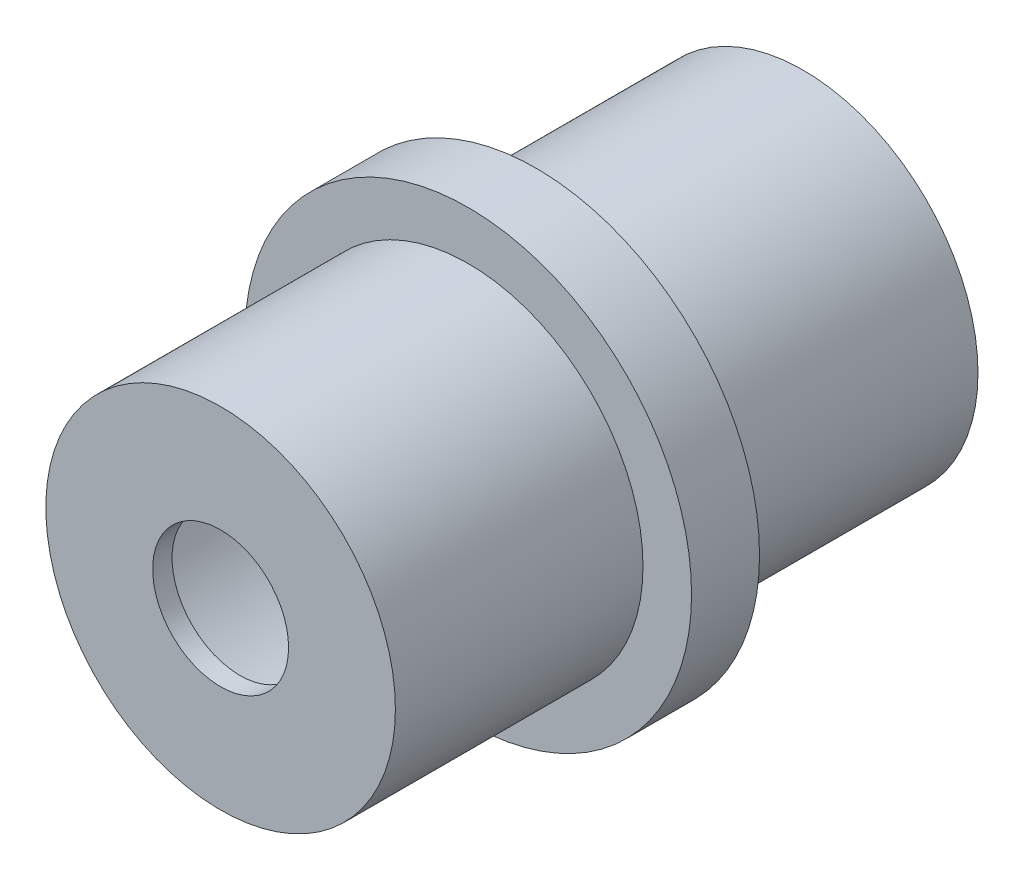
ISO-10303-21;
HEADER;
FILE_DESCRIPTION(('STEP AP214'),'2;1');
FILE_NAME('part.step','',(''),(''),'','','');
FILE_SCHEMA(('AUTOMOTIVE_DESIGN { 1 0 10303 214 1 1 1 1 }'));
ENDSEC;
DATA;
#1=APPLICATION_CONTEXT('core data for automotive mechanical design processes');
#2=APPLICATION_PROTOCOL_DEFINITION('international standard','automotive_design',2000,#1);
#3=PRODUCT_CONTEXT('',#1,'mechanical');
#4=PRODUCT('Part','Part','',(#3));
#5=PRODUCT_RELATED_PRODUCT_CATEGORY('part','',(#4));
#6=PRODUCT_DEFINITION_FORMATION('','',#4);
#7=PRODUCT_DEFINITION_CONTEXT('part definition',#1,'design');
#8=PRODUCT_DEFINITION('design','',#6,#7);
#9=PRODUCT_DEFINITION_SHAPE('','',#8);
#10=(LENGTH_UNIT() NAMED_UNIT(*) SI_UNIT(.MILLI.,.METRE.));
#11=(NAMED_UNIT(*) PLANE_ANGLE_UNIT() SI_UNIT($,.RADIAN.));
#12=(NAMED_UNIT(*) SI_UNIT($,.STERADIAN.) SOLID_ANGLE_UNIT());
#13=UNCERTAINTY_MEASURE_WITH_UNIT(LENGTH_MEASURE(1.E-05),#10,'distance_accuracy_value','');
#14=(GEOMETRIC_REPRESENTATION_CONTEXT(3) GLOBAL_UNCERTAINTY_ASSIGNED_CONTEXT((#13)) GLOBAL_UNIT_ASSIGNED_CONTEXT((#10,
#11,#12)) REPRESENTATION_CONTEXT('',''));
#15=CARTESIAN_POINT('',(0.,0.,0.));
#16=DIRECTION('',(0.,0.,1.));
#17=DIRECTION('',(1.,0.,0.));
#18=AXIS2_PLACEMENT_3D('',#15,#16,#17);
#19=CARTESIAN_POINT('',(0.,0.,1072.38147752167));
#20=DIRECTION('',(0.,0.,1.));
#21=DIRECTION('',(1.,0.,0.));
#22=AXIS2_PLACEMENT_3D('',#19,#20,#21);
#23=CYLINDRICAL_SURFACE('',#22,17.);
#24=CARTESIAN_POINT('',(0.,0.,2.));
#25=DIRECTION('',(0.,0.,1.));
#26=DIRECTION('',(1.,0.,0.));
#27=AXIS2_PLACEMENT_3D('',#24,#25,#26);
#28=CIRCLE('',#27,17.);
#29=CARTESIAN_POINT('',(17.,0.,2.));
#30=VERTEX_POINT('',#29);
#31=EDGE_CURVE('E289',#30,#30,#28,.T.);
#32=ORIENTED_EDGE('',*,*,#31,.F.);
#33=EDGE_LOOP('',(#32));
#34=FACE_BOUND('',#33,.T.);
#35=CARTESIAN_POINT('',(0.,0.,30.));
#36=DIRECTION('',(0.,0.,1.));
#37=DIRECTION('',(1.,0.,0.));
#38=AXIS2_PLACEMENT_3D('',#35,#36,#37);
#39=CIRCLE('',#38,17.);
#40=CARTESIAN_POINT('',(-4.68395766336508,16.3419870458829,30.));
#41=VERTEX_POINT('',#40);
#42=CARTESIAN_POINT('',(4.68395766336508,16.3419870458829,30.));
#43=VERTEX_POINT('',#42);
#44=EDGE_CURVE('E413',#41,#43,#39,.F.);
#45=ORIENTED_EDGE('',*,*,#44,.F.);
#46=DIRECTION('',(0.,0.,1.));
#47=VECTOR('',#46,1.);
#48=CARTESIAN_POINT('',(-4.68395766336508,16.3419870458829,29.));
#49=LINE('',#48,#47);
#50=CARTESIAN_POINT('',(-4.68395766336508,16.3419870458829,29.));
#51=VERTEX_POINT('',#50);
#52=EDGE_CURVE('E256',#51,#41,#49,.T.);
#53=ORIENTED_EDGE('',*,*,#52,.F.);
#54=CARTESIAN_POINT('',(0.,0.,29.));
#55=DIRECTION('',(0.,0.,1.));
#56=DIRECTION('',(1.,0.,0.));
#57=AXIS2_PLACEMENT_3D('',#54,#55,#56);
#58=CIRCLE('',#57,17.);
#59=CARTESIAN_POINT('',(4.68395766336508,16.3419870458829,29.));
#60=VERTEX_POINT('',#59);
#61=EDGE_CURVE('E781',#51,#60,#58,.T.);
#62=ORIENTED_EDGE('',*,*,#61,.T.);
#63=DIRECTION('',(0.,0.,1.));
#64=VECTOR('',#63,1.);
#65=CARTESIAN_POINT('',(4.68395766336508,16.3419870458829,29.));
#66=LINE('',#65,#64);
#67=EDGE_CURVE('E260',#60,#43,#66,.T.);
#68=ORIENTED_EDGE('',*,*,#67,.T.);
#69=EDGE_LOOP('',(#45,#53,#62,#68));
#70=FACE_BOUND('',#69,.T.);
#71=ADVANCED_FACE('F82',(#34,#70),#23,.F.);
#72=CARTESIAN_POINT('',(0.,0.,29.));
#73=DIRECTION('',(0.939692620785896,-0.342020143325703,0.));
#74=DIRECTION('',(0.342020143325703,0.939692620785896,0.));
#75=AXIS2_PLACEMENT_3D('',#72,#73,#74);
#76=PLANE('',#75);
#77=DIRECTION('',(0.342020143325703,0.939692620785896,0.));
#78=VECTOR('',#77,1.);
#79=CARTESIAN_POINT('',(0.,0.,30.));
#80=LINE('',#79,#78);
#81=CARTESIAN_POINT('',(6.49838272318844,17.8541597949322,30.));
#82=VERTEX_POINT('',#81);
#83=CARTESIAN_POINT('',(7.52444315316555,20.6732376572899,30.));
#84=VERTEX_POINT('',#83);
#85=EDGE_CURVE('E229',#82,#84,#80,.T.);
#86=ORIENTED_EDGE('',*,*,#85,.T.);
#87=DIRECTION('',(0.,0.,1.));
#88=VECTOR('',#87,1.);
#89=CARTESIAN_POINT('',(7.52444315316555,20.6732376572899,29.));
#90=LINE('',#89,#88);
#91=CARTESIAN_POINT('',(7.52444315316555,20.6732376572899,29.));
#92=VERTEX_POINT('',#91);
#93=EDGE_CURVE('E226',#92,#84,#90,.T.);
#94=ORIENTED_EDGE('',*,*,#93,.F.);
#95=DIRECTION('',(0.342020143325703,0.939692620785896,0.));
#96=VECTOR('',#95,1.);
#97=CARTESIAN_POINT('',(0.,0.,29.));
#98=LINE('',#97,#96);
#99=CARTESIAN_POINT('',(6.49838272318844,17.8541597949322,29.));
#100=VERTEX_POINT('',#99);
#101=EDGE_CURVE('E786',#100,#92,#98,.T.);
#102=ORIENTED_EDGE('',*,*,#101,.F.);
#103=DIRECTION('',(0.,0.,1.));
#104=VECTOR('',#103,1.);
#105=CARTESIAN_POINT('',(6.49838272318844,17.8541597949322,29.));
#106=LINE('',#105,#104);
#107=EDGE_CURVE('E280',#100,#82,#106,.T.);
#108=ORIENTED_EDGE('',*,*,#107,.T.);
#109=EDGE_LOOP('',(#86,#94,#102,#108));
#110=FACE_BOUND('',#109,.T.);
#111=ADVANCED_FACE('F324',(#110),#76,.F.);
#112=CARTESIAN_POINT('',(0.,0.,29.));
#113=DIRECTION('',(0.,0.,1.));
#114=DIRECTION('',(1.,0.,0.));
#115=AXIS2_PLACEMENT_3D('',#112,#113,#114);
#116=CYLINDRICAL_SURFACE('',#115,19.);
#117=DIRECTION('',(0.,0.,1.));
#118=VECTOR('',#117,1.);
#119=CARTESIAN_POINT('',(-6.49838272317903,17.8541597949354,29.));
#120=LINE('',#119,#118);
#121=CARTESIAN_POINT('',(-6.49838272317903,17.8541597949354,29.));
#122=VERTEX_POINT('',#121);
#123=CARTESIAN_POINT('',(-6.49838272317903,17.8541597949354,30.));
#124=VERTEX_POINT('',#123);
#125=EDGE_CURVE('E246',#122,#124,#120,.T.);
#126=ORIENTED_EDGE('',*,*,#125,.T.);
#127=CARTESIAN_POINT('',(0.,0.,30.));
#128=DIRECTION('',(0.,0.,1.));
#129=DIRECTION('',(1.,0.,0.));
#130=AXIS2_PLACEMENT_3D('',#127,#128,#129);
#131=CIRCLE('',#130,19.);
#132=EDGE_CURVE('E235',#82,#124,#131,.F.);
#133=ORIENTED_EDGE('',*,*,#132,.F.);
#134=ORIENTED_EDGE('',*,*,#107,.F.);
#135=CARTESIAN_POINT('',(0.,0.,29.));
#136=DIRECTION('',(0.,0.,1.));
#137=DIRECTION('',(1.,0.,0.));
#138=AXIS2_PLACEMENT_3D('',#135,#136,#137);
#139=CIRCLE('',#138,19.);
#140=EDGE_CURVE('E401',#100,#122,#139,.F.);
#141=ORIENTED_EDGE('',*,*,#140,.T.);
#142=EDGE_LOOP('',(#126,#133,#134,#141));
#143=FACE_BOUND('',#142,.T.);
#144=ADVANCED_FACE('F330',(#143),#116,.F.);
#145=CARTESIAN_POINT('',(6.36613778460758E-11,2.31708466085675E-11,29.));
#146=DIRECTION('',(0.939692620784855,0.342020143328563,0.));
#147=DIRECTION('',(-0.342020143328563,0.939692620784855,0.));
#148=AXIS2_PLACEMENT_3D('',#145,#146,#147);
#149=PLANE('',#148);
#150=DIRECTION('',(0.,0.,1.));
#151=VECTOR('',#150,1.);
#152=CARTESIAN_POINT('',(-7.52444315316472,20.67323765729,29.));
#153=LINE('',#152,#151);
#154=CARTESIAN_POINT('',(-7.52444315316472,20.67323765729,29.));
#155=VERTEX_POINT('',#154);
#156=CARTESIAN_POINT('',(-7.52444315316472,20.67323765729,30.));
#157=VERTEX_POINT('',#156);
#158=EDGE_CURVE('E224',#155,#157,#153,.T.);
#159=ORIENTED_EDGE('',*,*,#158,.T.);
#160=DIRECTION('',(-0.342020143328563,0.939692620784855,0.));
#161=VECTOR('',#160,1.);
#162=CARTESIAN_POINT('',(6.36613778460758E-11,2.31708466085675E-11,30.));
#163=LINE('',#162,#161);
#164=EDGE_CURVE('E230',#124,#157,#163,.T.);
#165=ORIENTED_EDGE('',*,*,#164,.F.);
#166=ORIENTED_EDGE('',*,*,#125,.F.);
#167=DIRECTION('',(-0.342020143328563,0.939692620784855,0.));
#168=VECTOR('',#167,1.);
#169=CARTESIAN_POINT('',(6.36613778460758E-11,2.31708466085675E-11,29.));
#170=LINE('',#169,#168);
#171=EDGE_CURVE('E242',#122,#155,#170,.T.);
#172=ORIENTED_EDGE('',*,*,#171,.T.);
#173=EDGE_LOOP('',(#159,#165,#166,#172));
#174=FACE_BOUND('',#173,.T.);
#175=ADVANCED_FACE('F241',(#174),#149,.T.);
#176=CARTESIAN_POINT('',(-1.,19.9724758914095,29.));
#177=CARTESIAN_POINT('',(-1.83751743884076,19.9724758914095,29.));
#178=CARTESIAN_POINT('',(-3.40070254752872,17.6066170470149,29.));
#179=CARTESIAN_POINT('',(-4.50524300138782,16.5181078502257,29.));
#180=B_SPLINE_CURVE_WITH_KNOTS('',3,(#176,#177,#178,#179),.UNSPECIFIED.,.F.,.F.,(4,4),(0.,1.),.UNSPECIFIED.);
#181=DIRECTION('',(0.,0.,1.));
#182=VECTOR('',#181,1.);
#183=SURFACE_OF_LINEAR_EXTRUSION('',#180,#182);
#184=DIRECTION('',(0.,0.,1.));
#185=VECTOR('',#184,1.);
#186=CARTESIAN_POINT('',(-4.50524300138782,16.5181078502257,29.));
#187=LINE('',#186,#185);
#188=CARTESIAN_POINT('',(-4.50524300138782,16.5181078502257,29.));
#189=VERTEX_POINT('',#188);
#190=CARTESIAN_POINT('',(-4.50524300138782,16.5181078502257,30.));
#191=VERTEX_POINT('',#190);
#192=EDGE_CURVE('E252',#189,#191,#187,.T.);
#193=ORIENTED_EDGE('',*,*,#192,.T.);
#194=CARTESIAN_POINT('',(-1.,19.9724758914095,30.));
#195=CARTESIAN_POINT('',(-1.83751743884076,19.9724758914095,30.));
#196=CARTESIAN_POINT('',(-3.40070254752872,17.6066170470149,30.));
#197=CARTESIAN_POINT('',(-4.50524300138782,16.5181078502257,30.));
#198=B_SPLINE_CURVE_WITH_KNOTS('',3,(#194,#195,#196,#197),.UNSPECIFIED.,.F.,.F.,(4,4),(0.,1.),.UNSPECIFIED.);
#199=CARTESIAN_POINT('',(-1.,19.9724758914095,30.));
#200=VERTEX_POINT('',#199);
#201=EDGE_CURVE('E811',#200,#191,#198,.T.);
#202=ORIENTED_EDGE('',*,*,#201,.F.);
#203=DIRECTION('',(0.,0.,1.));
#204=VECTOR('',#203,1.);
#205=CARTESIAN_POINT('',(-1.,19.9724758914095,29.));
#206=LINE('',#205,#204);
#207=CARTESIAN_POINT('',(-1.,19.9724758914095,29.));
#208=VERTEX_POINT('',#207);
#209=EDGE_CURVE('E272',#208,#200,#206,.T.);
#210=ORIENTED_EDGE('',*,*,#209,.F.);
#211=EDGE_CURVE('E390',#208,#189,#180,.T.);
#212=ORIENTED_EDGE('',*,*,#211,.T.);
#213=EDGE_LOOP('',(#193,#202,#210,#212));
#214=FACE_BOUND('',#213,.T.);
#215=ADVANCED_FACE('F469',(#214),#183,.T.);
#216=CARTESIAN_POINT('',(-10.4778611043263,10.6321760935121,29.));
#217=DIRECTION('',(-0.701919056131923,0.712256722424485,0.));
#218=DIRECTION('',(-0.712256722424485,-0.701919056131923,0.));
#219=AXIS2_PLACEMENT_3D('',#216,#217,#218);
#220=PLANE('',#219);
#221=ORIENTED_EDGE('',*,*,#52,.T.);
#222=DIRECTION('',(-0.712256722424485,-0.701919056131923,0.));
#223=VECTOR('',#222,1.);
#224=CARTESIAN_POINT('',(-10.4778611043263,10.6321760935121,30.));
#225=LINE('',#224,#223);
#226=EDGE_CURVE('E453',#191,#41,#225,.T.);
#227=ORIENTED_EDGE('',*,*,#226,.F.);
#228=ORIENTED_EDGE('',*,*,#192,.F.);
#229=DIRECTION('',(-0.712256722424485,-0.701919056131923,0.));
#230=VECTOR('',#229,1.);
#231=CARTESIAN_POINT('',(-10.4778611043263,10.6321760935121,29.));
#232=LINE('',#231,#230);
#233=EDGE_CURVE('E784',#189,#51,#232,.T.);
#234=ORIENTED_EDGE('',*,*,#233,.T.);
#235=EDGE_LOOP('',(#221,#227,#228,#234));
#236=FACE_BOUND('',#235,.T.);
#237=ADVANCED_FACE('F612',(#236),#220,.T.);
#238=CARTESIAN_POINT('',(10.4778611043263,10.6321760935121,29.));
#239=DIRECTION('',(-0.701919056131923,-0.712256722424485,0.));
#240=DIRECTION('',(0.712256722424485,-0.701919056131923,0.));
#241=AXIS2_PLACEMENT_3D('',#238,#239,#240);
#242=PLANE('',#241);
#243=DIRECTION('',(0.712256722424485,-0.701919056131923,0.));
#244=VECTOR('',#243,1.);
#245=CARTESIAN_POINT('',(10.4778611043263,10.6321760935121,30.));
#246=LINE('',#245,#244);
#247=CARTESIAN_POINT('',(4.50524300138782,16.5181078502257,30.));
#248=VERTEX_POINT('',#247);
#249=EDGE_CURVE('E442',#248,#43,#246,.T.);
#250=ORIENTED_EDGE('',*,*,#249,.T.);
#251=ORIENTED_EDGE('',*,*,#67,.F.);
#252=DIRECTION('',(0.712256722424485,-0.701919056131923,0.));
#253=VECTOR('',#252,1.);
#254=CARTESIAN_POINT('',(10.4778611043263,10.6321760935121,29.));
#255=LINE('',#254,#253);
#256=CARTESIAN_POINT('',(4.50524300138782,16.5181078502257,29.));
#257=VERTEX_POINT('',#256);
#258=EDGE_CURVE('E775',#257,#60,#255,.T.);
#259=ORIENTED_EDGE('',*,*,#258,.F.);
#260=DIRECTION('',(0.,0.,1.));
#261=VECTOR('',#260,1.);
#262=CARTESIAN_POINT('',(4.50524300138782,16.5181078502257,29.));
#263=LINE('',#262,#261);
#264=EDGE_CURVE('E264',#257,#248,#263,.T.);
#265=ORIENTED_EDGE('',*,*,#264,.T.);
#266=EDGE_LOOP('',(#250,#251,#259,#265));
#267=FACE_BOUND('',#266,.T.);
#268=ADVANCED_FACE('F621',(#267),#242,.F.);
#269=CARTESIAN_POINT('',(1.,19.9724758914095,29.));
#270=CARTESIAN_POINT('',(1.83751743884076,19.9724758914095,29.));
#271=CARTESIAN_POINT('',(3.40070254752872,17.6066170470149,29.));
#272=CARTESIAN_POINT('',(4.50524300138782,16.5181078502257,29.));
#273=B_SPLINE_CURVE_WITH_KNOTS('',3,(#269,#270,#271,#272),.UNSPECIFIED.,.F.,.F.,(4,4),(0.,1.),.UNSPECIFIED.);
#274=DIRECTION('',(0.,0.,1.));
#275=VECTOR('',#274,1.);
#276=SURFACE_OF_LINEAR_EXTRUSION('',#273,#275);
#277=CARTESIAN_POINT('',(1.,19.9724758914095,30.));
#278=CARTESIAN_POINT('',(1.83751743884076,19.9724758914095,30.));
#279=CARTESIAN_POINT('',(3.40070254752872,17.6066170470149,30.));
#280=CARTESIAN_POINT('',(4.50524300138782,16.5181078502257,30.));
#281=B_SPLINE_CURVE_WITH_KNOTS('',3,(#277,#278,#279,#280),.UNSPECIFIED.,.F.,.F.,(4,4),(0.,1.),.UNSPECIFIED.);
#282=CARTESIAN_POINT('',(1.,19.9724758914095,30.));
#283=VERTEX_POINT('',#282);
#284=EDGE_CURVE('E105',#283,#248,#281,.T.);
#285=ORIENTED_EDGE('',*,*,#284,.T.);
#286=ORIENTED_EDGE('',*,*,#264,.F.);
#287=CARTESIAN_POINT('',(1.,19.9724758914095,29.));
#288=VERTEX_POINT('',#287);
#289=EDGE_CURVE('E769',#288,#257,#273,.T.);
#290=ORIENTED_EDGE('',*,*,#289,.F.);
#291=DIRECTION('',(0.,0.,1.));
#292=VECTOR('',#291,1.);
#293=CARTESIAN_POINT('',(1.,19.9724758914095,29.));
#294=LINE('',#293,#292);
#295=EDGE_CURVE('E268',#288,#283,#294,.T.);
#296=ORIENTED_EDGE('',*,*,#295,.T.);
#297=EDGE_LOOP('',(#285,#286,#290,#296));
#298=FACE_BOUND('',#297,.T.);
#299=ADVANCED_FACE('F344',(#298),#276,.F.);
#300=CARTESIAN_POINT('',(0.,19.9724758914095,29.));
#301=DIRECTION('',(0.,-1.,0.));
#302=DIRECTION('',(1.,0.,0.));
#303=AXIS2_PLACEMENT_3D('',#300,#301,#302);
#304=PLANE('',#303);
#305=DIRECTION('',(1.,0.,0.));
#306=VECTOR('',#305,1.);
#307=CARTESIAN_POINT('',(0.,19.9724758914095,30.));
#308=LINE('',#307,#306);
#309=EDGE_CURVE('E806',#200,#283,#308,.T.);
#310=ORIENTED_EDGE('',*,*,#309,.T.);
#311=ORIENTED_EDGE('',*,*,#295,.F.);
#312=DIRECTION('',(1.,0.,0.));
#313=VECTOR('',#312,1.);
#314=CARTESIAN_POINT('',(0.,19.9724758914095,29.));
#315=LINE('',#314,#313);
#316=EDGE_CURVE('E460',#208,#288,#315,.T.);
#317=ORIENTED_EDGE('',*,*,#316,.F.);
#318=ORIENTED_EDGE('',*,*,#209,.T.);
#319=EDGE_LOOP('',(#310,#311,#317,#318));
#320=FACE_BOUND('',#319,.T.);
#321=ADVANCED_FACE('F339',(#320),#304,.F.);
#322=CARTESIAN_POINT('',(0.,0.,58.));
#323=DIRECTION('',(0.,0.,1.));
#324=DIRECTION('',(1.,0.,0.));
#325=AXIS2_PLACEMENT_3D('',#322,#323,#324);
#326=CIRCLE('',#325,17.);
#327=CARTESIAN_POINT('',(17.,0.,58.));
#328=VERTEX_POINT('',#327);
#329=EDGE_CURVE('E292',#328,#328,#326,.T.);
#330=ORIENTED_EDGE('',*,*,#329,.T.);
#331=EDGE_LOOP('',(#330));
#332=FACE_BOUND('',#331,.T.);
#333=CARTESIAN_POINT('',(-4.68395766336508,16.3419870458829,32.));
#334=VERTEX_POINT('',#333);
#335=CARTESIAN_POINT('',(-4.68395766336508,16.3419870458829,32.9999999999999));
#336=VERTEX_POINT('',#335);
#337=EDGE_CURVE('E259',#334,#336,#49,.T.);
#338=ORIENTED_EDGE('',*,*,#337,.F.);
#339=CARTESIAN_POINT('',(0.,0.,32.));
#340=DIRECTION('',(0.,0.,1.));
#341=DIRECTION('',(1.,0.,0.));
#342=AXIS2_PLACEMENT_3D('',#339,#340,#341);
#343=CIRCLE('',#342,17.);
#344=CARTESIAN_POINT('',(4.68395766336508,16.3419870458829,32.));
#345=VERTEX_POINT('',#344);
#346=EDGE_CURVE('E353',#334,#345,#343,.F.);
#347=ORIENTED_EDGE('',*,*,#346,.T.);
#348=CARTESIAN_POINT('',(4.68395766336508,16.3419870458829,33.));
#349=VERTEX_POINT('',#348);
#350=EDGE_CURVE('E263',#345,#349,#66,.T.);
#351=ORIENTED_EDGE('',*,*,#350,.T.);
#352=CARTESIAN_POINT('',(0.,0.,33.));
#353=DIRECTION('',(0.,0.,1.));
#354=DIRECTION('',(1.,0.,0.));
#355=AXIS2_PLACEMENT_3D('',#352,#353,#354);
#356=CIRCLE('',#355,17.);
#357=EDGE_CURVE('E356',#336,#349,#356,.T.);
#358=ORIENTED_EDGE('',*,*,#357,.F.);
#359=EDGE_LOOP('',(#338,#347,#351,#358));
#360=FACE_BOUND('',#359,.T.);
#361=ADVANCED_FACE('F321',(#332,#360),#23,.F.);
#362=CARTESIAN_POINT('',(0.,0.,27.5));
#363=DIRECTION('',(0.,0.,-1.));
#364=DIRECTION('',(-1.,0.,0.));
#365=AXIS2_PLACEMENT_3D('',#362,#363,#364);
#366=PLANE('',#365);
#367=CARTESIAN_POINT('',(0.,0.,27.5000000000001));
#368=DIRECTION('',(0.,0.,1.));
#369=DIRECTION('',(1.,0.,0.));
#370=AXIS2_PLACEMENT_3D('',#367,#368,#369);
#371=CIRCLE('',#370,18.);
#372=CARTESIAN_POINT('',(18.,0.,27.5000000000001));
#373=VERTEX_POINT('',#372);
#374=EDGE_CURVE('E276',#373,#373,#371,.T.);
#375=ORIENTED_EDGE('',*,*,#374,.T.);
#376=EDGE_LOOP('',(#375));
#377=FACE_BOUND('',#376,.T.);
#378=CARTESIAN_POINT('',(0.,0.,27.5000000000001));
#379=DIRECTION('',(0.,0.,1.));
#380=DIRECTION('',(1.,0.,0.));
#381=AXIS2_PLACEMENT_3D('',#378,#379,#380);
#382=CIRCLE('',#381,23.);
#383=CARTESIAN_POINT('',(23.,0.,27.5000000000001));
#384=VERTEX_POINT('',#383);
#385=EDGE_CURVE('E12',#384,#384,#382,.T.);
#386=ORIENTED_EDGE('',*,*,#385,.F.);
#387=EDGE_LOOP('',(#386));
#388=FACE_BOUND('',#387,.T.);
#389=ADVANCED_FACE('F84',(#377,#388),#366,.T.);
#390=CARTESIAN_POINT('',(0.,0.,1072.38147752167));
#391=DIRECTION('',(0.,0.,1.));
#392=DIRECTION('',(1.,0.,0.));
#393=AXIS2_PLACEMENT_3D('',#390,#391,#392);
#394=CYLINDRICAL_SURFACE('',#393,23.);
#395=ORIENTED_EDGE('',*,*,#385,.T.);
#396=EDGE_LOOP('',(#395));
#397=FACE_BOUND('',#396,.T.);
#398=CARTESIAN_POINT('',(0.,0.,34.5));
#399=DIRECTION('',(0.,0.,1.));
#400=DIRECTION('',(1.,0.,0.));
#401=AXIS2_PLACEMENT_3D('',#398,#399,#400);
#402=CIRCLE('',#401,23.);
#403=CARTESIAN_POINT('',(23.,0.,34.5));
#404=VERTEX_POINT('',#403);
#405=EDGE_CURVE('E90',#404,#404,#402,.T.);
#406=ORIENTED_EDGE('',*,*,#405,.F.);
#407=EDGE_LOOP('',(#406));
#408=FACE_BOUND('',#407,.T.);
#409=ADVANCED_FACE('F311',(#397,#408),#394,.T.);
#410=CARTESIAN_POINT('',(0.,0.,34.5));
#411=DIRECTION('',(0.,0.,-1.));
#412=DIRECTION('',(-1.,0.,0.));
#413=AXIS2_PLACEMENT_3D('',#410,#411,#412);
#414=PLANE('',#413);
#415=CARTESIAN_POINT('',(0.,0.,34.5));
#416=DIRECTION('',(0.,0.,1.));
#417=DIRECTION('',(1.,0.,0.));
#418=AXIS2_PLACEMENT_3D('',#415,#416,#417);
#419=CIRCLE('',#418,18.);
#420=CARTESIAN_POINT('',(18.,0.,34.5));
#421=VERTEX_POINT('',#420);
#422=EDGE_CURVE('E304',#421,#421,#419,.T.);
#423=ORIENTED_EDGE('',*,*,#422,.F.);
#424=EDGE_LOOP('',(#423));
#425=FACE_BOUND('',#424,.T.);
#426=ORIENTED_EDGE('',*,*,#405,.T.);
#427=EDGE_LOOP('',(#426));
#428=FACE_BOUND('',#427,.T.);
#429=ADVANCED_FACE('F309',(#425,#428),#414,.F.);
#430=CARTESIAN_POINT('',(0.,0.,1072.38147752167));
#431=DIRECTION('',(0.,0.,1.));
#432=DIRECTION('',(1.,0.,0.));
#433=AXIS2_PLACEMENT_3D('',#430,#431,#432);
#434=CYLINDRICAL_SURFACE('',#433,18.);
#435=ORIENTED_EDGE('',*,*,#422,.T.);
#436=EDGE_LOOP('',(#435));
#437=FACE_BOUND('',#436,.T.);
#438=CARTESIAN_POINT('',(0.,0.,60.0000000000001));
#439=DIRECTION('',(0.,0.,1.));
#440=DIRECTION('',(1.,0.,0.));
#441=AXIS2_PLACEMENT_3D('',#438,#439,#440);
#442=CIRCLE('',#441,18.);
#443=CARTESIAN_POINT('',(18.,0.,60.0000000000001));
#444=VERTEX_POINT('',#443);
#445=EDGE_CURVE('E301',#444,#444,#442,.T.);
#446=ORIENTED_EDGE('',*,*,#445,.F.);
#447=EDGE_LOOP('',(#446));
#448=FACE_BOUND('',#447,.T.);
#449=ADVANCED_FACE('F318',(#437,#448),#434,.T.);
#450=CARTESIAN_POINT('',(0.,0.,60.));
#451=DIRECTION('',(0.,0.,1.));
#452=DIRECTION('',(1.,0.,0.));
#453=AXIS2_PLACEMENT_3D('',#450,#451,#452);
#454=PLANE('',#453);
#455=ORIENTED_EDGE('',*,*,#445,.T.);
#456=EDGE_LOOP('',(#455));
#457=FACE_BOUND('',#456,.T.);
#458=CARTESIAN_POINT('',(0.,0.,60.0000000000001));
#459=DIRECTION('',(0.,0.,1.));
#460=DIRECTION('',(1.,0.,0.));
#461=AXIS2_PLACEMENT_3D('',#458,#459,#460);
#462=CIRCLE('',#461,7.00000000000037);
#463=CARTESIAN_POINT('',(7.00000000000037,0.,60.0000000000001));
#464=VERTEX_POINT('',#463);
#465=EDGE_CURVE('E298',#464,#464,#462,.T.);
#466=ORIENTED_EDGE('',*,*,#465,.F.);
#467=EDGE_LOOP('',(#466));
#468=FACE_BOUND('',#467,.T.);
#469=ADVANCED_FACE('F497',(#457,#468),#454,.T.);
#470=CARTESIAN_POINT('',(0.,0.,1072.38147752167));
#471=DIRECTION('',(0.,0.,1.));
#472=DIRECTION('',(1.,0.,0.));
#473=AXIS2_PLACEMENT_3D('',#470,#471,#472);
#474=CYLINDRICAL_SURFACE('',#473,7.00000000000037);
#475=CARTESIAN_POINT('',(0.,0.,58.));
#476=DIRECTION('',(0.,0.,1.));
#477=DIRECTION('',(1.,0.,0.));
#478=AXIS2_PLACEMENT_3D('',#475,#476,#477);
#479=CIRCLE('',#478,7.00000000000037);
#480=CARTESIAN_POINT('',(7.00000000000037,0.,58.));
#481=VERTEX_POINT('',#480);
#482=EDGE_CURVE('E295',#481,#481,#479,.T.);
#483=ORIENTED_EDGE('',*,*,#482,.F.);
#484=EDGE_LOOP('',(#483));
#485=FACE_BOUND('',#484,.T.);
#486=ORIENTED_EDGE('',*,*,#465,.T.);
#487=EDGE_LOOP('',(#486));
#488=FACE_BOUND('',#487,.T.);
#489=ADVANCED_FACE('F489',(#485,#488),#474,.F.);
#490=CARTESIAN_POINT('',(0.,0.,58.));
#491=DIRECTION('',(0.,0.,1.));
#492=DIRECTION('',(1.,0.,0.));
#493=AXIS2_PLACEMENT_3D('',#490,#491,#492);
#494=PLANE('',#493);
#495=ORIENTED_EDGE('',*,*,#329,.F.);
#496=EDGE_LOOP('',(#495));
#497=FACE_BOUND('',#496,.T.);
#498=ORIENTED_EDGE('',*,*,#482,.T.);
#499=EDGE_LOOP('',(#498));
#500=FACE_BOUND('',#499,.T.);
#501=ADVANCED_FACE('F484',(#497,#500),#494,.F.);
#502=CARTESIAN_POINT('',(0.,0.,2.));
#503=DIRECTION('',(0.,0.,1.));
#504=DIRECTION('',(1.,0.,0.));
#505=AXIS2_PLACEMENT_3D('',#502,#503,#504);
#506=PLANE('',#505);
#507=ORIENTED_EDGE('',*,*,#31,.T.);
#508=EDGE_LOOP('',(#507));
#509=FACE_BOUND('',#508,.T.);
#510=CARTESIAN_POINT('',(0.,0.,2.));
#511=DIRECTION('',(0.,0.,1.));
#512=DIRECTION('',(1.,0.,0.));
#513=AXIS2_PLACEMENT_3D('',#510,#511,#512);
#514=CIRCLE('',#513,13.);
#515=CARTESIAN_POINT('',(13.,0.,2.));
#516=VERTEX_POINT('',#515);
#517=EDGE_CURVE('E286',#516,#516,#514,.T.);
#518=ORIENTED_EDGE('',*,*,#517,.F.);
#519=EDGE_LOOP('',(#518));
#520=FACE_BOUND('',#519,.T.);
#521=ADVANCED_FACE('F481',(#509,#520),#506,.T.);
#522=CARTESIAN_POINT('',(0.,0.,1072.38147752167));
#523=DIRECTION('',(0.,0.,1.));
#524=DIRECTION('',(1.,0.,0.));
#525=AXIS2_PLACEMENT_3D('',#522,#523,#524);
#526=CYLINDRICAL_SURFACE('',#525,13.);
#527=CARTESIAN_POINT('',(0.,0.,0.));
#528=DIRECTION('',(0.,0.,1.));
#529=DIRECTION('',(1.,0.,0.));
#530=AXIS2_PLACEMENT_3D('',#527,#528,#529);
#531=CIRCLE('',#530,13.);
#532=CARTESIAN_POINT('',(13.,0.,0.));
#533=VERTEX_POINT('',#532);
#534=EDGE_CURVE('E283',#533,#533,#531,.T.);
#535=ORIENTED_EDGE('',*,*,#534,.F.);
#536=EDGE_LOOP('',(#535));
#537=FACE_BOUND('',#536,.T.);
#538=ORIENTED_EDGE('',*,*,#517,.T.);
#539=EDGE_LOOP('',(#538));
#540=FACE_BOUND('',#539,.T.);
#541=ADVANCED_FACE('F478',(#537,#540),#526,.F.);
#542=CARTESIAN_POINT('',(0.,0.,0.));
#543=DIRECTION('',(0.,0.,1.));
#544=DIRECTION('',(1.,0.,0.));
#545=AXIS2_PLACEMENT_3D('',#542,#543,#544);
#546=PLANE('',#545);
#547=CARTESIAN_POINT('',(0.,0.,0.));
#548=DIRECTION('',(0.,0.,1.));
#549=DIRECTION('',(1.,0.,0.));
#550=AXIS2_PLACEMENT_3D('',#547,#548,#549);
#551=CIRCLE('',#550,18.);
#552=CARTESIAN_POINT('',(18.,0.,0.));
#553=VERTEX_POINT('',#552);
#554=EDGE_CURVE('E279',#553,#553,#551,.T.);
#555=ORIENTED_EDGE('',*,*,#554,.F.);
#556=EDGE_LOOP('',(#555));
#557=FACE_BOUND('',#556,.T.);
#558=ORIENTED_EDGE('',*,*,#534,.T.);
#559=EDGE_LOOP('',(#558));
#560=FACE_BOUND('',#559,.T.);
#561=ADVANCED_FACE('F474',(#557,#560),#546,.F.);
#562=CARTESIAN_POINT('',(0.,0.,1072.38147752167));
#563=DIRECTION('',(0.,0.,1.));
#564=DIRECTION('',(1.,0.,0.));
#565=AXIS2_PLACEMENT_3D('',#562,#563,#564);
#566=CYLINDRICAL_SURFACE('',#565,18.);
#567=ORIENTED_EDGE('',*,*,#554,.T.);
#568=EDGE_LOOP('',(#567));
#569=FACE_BOUND('',#568,.T.);
#570=ORIENTED_EDGE('',*,*,#374,.F.);
#571=EDGE_LOOP('',(#570));
#572=FACE_BOUND('',#571,.T.);
#573=ADVANCED_FACE('F471',(#569,#572),#566,.T.);
#574=CARTESIAN_POINT('',(7.52444315316555,20.6732376572899,32.));
#575=VERTEX_POINT('',#574);
#576=CARTESIAN_POINT('',(7.52444315316555,20.6732376572899,33.));
#577=VERTEX_POINT('',#576);
#578=EDGE_CURVE('E251',#575,#577,#90,.T.);
#579=ORIENTED_EDGE('',*,*,#578,.F.);
#580=DIRECTION('',(0.342020143325703,0.939692620785896,0.));
#581=VECTOR('',#580,1.);
#582=CARTESIAN_POINT('',(0.,0.,32.));
#583=LINE('',#582,#581);
#584=CARTESIAN_POINT('',(6.49838272318844,17.8541597949322,32.));
#585=VERTEX_POINT('',#584);
#586=EDGE_CURVE('E796',#585,#575,#583,.T.);
#587=ORIENTED_EDGE('',*,*,#586,.F.);
#588=CARTESIAN_POINT('',(6.49838272318844,17.8541597949322,33.));
#589=VERTEX_POINT('',#588);
#590=EDGE_CURVE('E392',#585,#589,#106,.T.);
#591=ORIENTED_EDGE('',*,*,#590,.T.);
#592=DIRECTION('',(0.342020143325703,0.939692620785896,0.));
#593=VECTOR('',#592,1.);
#594=CARTESIAN_POINT('',(0.,0.,33.));
#595=LINE('',#594,#593);
#596=EDGE_CURVE('E374',#589,#577,#595,.T.);
#597=ORIENTED_EDGE('',*,*,#596,.T.);
#598=EDGE_LOOP('',(#579,#587,#591,#597));
#599=FACE_BOUND('',#598,.T.);
#600=ADVANCED_FACE('F333',(#599),#76,.F.);
#601=CARTESIAN_POINT('',(0.,0.,32.));
#602=DIRECTION('',(0.,0.,1.));
#603=DIRECTION('',(1.,0.,0.));
#604=AXIS2_PLACEMENT_3D('',#601,#602,#603);
#605=CIRCLE('',#604,19.);
#606=CARTESIAN_POINT('',(-6.49838272317903,17.8541597949354,32.));
#607=VERTEX_POINT('',#606);
#608=EDGE_CURVE('E239',#585,#607,#605,.F.);
#609=ORIENTED_EDGE('',*,*,#608,.T.);
#610=CARTESIAN_POINT('',(-6.49838272317903,17.8541597949354,33.));
#611=VERTEX_POINT('',#610);
#612=EDGE_CURVE('E243',#607,#611,#120,.T.);
#613=ORIENTED_EDGE('',*,*,#612,.T.);
#614=CARTESIAN_POINT('',(0.,0.,33.));
#615=DIRECTION('',(0.,0.,1.));
#616=DIRECTION('',(1.,0.,0.));
#617=AXIS2_PLACEMENT_3D('',#614,#615,#616);
#618=CIRCLE('',#617,19.);
#619=EDGE_CURVE('E388',#589,#611,#618,.F.);
#620=ORIENTED_EDGE('',*,*,#619,.F.);
#621=ORIENTED_EDGE('',*,*,#590,.F.);
#622=EDGE_LOOP('',(#609,#613,#620,#621));
#623=FACE_BOUND('',#622,.T.);
#624=ADVANCED_FACE('F596',(#623),#116,.F.);
#625=DIRECTION('',(-0.342020143328563,0.939692620784855,0.));
#626=VECTOR('',#625,1.);
#627=CARTESIAN_POINT('',(6.36613778460758E-11,2.31708466085675E-11,32.));
#628=LINE('',#627,#626);
#629=CARTESIAN_POINT('',(-7.52444315316472,20.67323765729,32.));
#630=VERTEX_POINT('',#629);
#631=EDGE_CURVE('E791',#607,#630,#628,.T.);
#632=ORIENTED_EDGE('',*,*,#631,.T.);
#633=CARTESIAN_POINT('',(-7.52444315316472,20.67323765729,33.));
#634=VERTEX_POINT('',#633);
#635=EDGE_CURVE('E244',#630,#634,#153,.T.);
#636=ORIENTED_EDGE('',*,*,#635,.T.);
#637=DIRECTION('',(-0.342020143328563,0.939692620784855,0.));
#638=VECTOR('',#637,1.);
#639=CARTESIAN_POINT('',(6.36613778460758E-11,2.31708466085675E-11,33.));
#640=LINE('',#639,#638);
#641=EDGE_CURVE('E385',#611,#634,#640,.T.);
#642=ORIENTED_EDGE('',*,*,#641,.F.);
#643=ORIENTED_EDGE('',*,*,#612,.F.);
#644=EDGE_LOOP('',(#632,#636,#642,#643));
#645=FACE_BOUND('',#644,.T.);
#646=ADVANCED_FACE('F468',(#645),#149,.T.);
#647=CARTESIAN_POINT('',(-1.,19.9724758914095,32.));
#648=CARTESIAN_POINT('',(-1.83751743884076,19.9724758914095,32.));
#649=CARTESIAN_POINT('',(-3.40070254752872,17.6066170470149,32.));
#650=CARTESIAN_POINT('',(-4.50524300138782,16.5181078502257,32.));
#651=B_SPLINE_CURVE_WITH_KNOTS('',3,(#647,#648,#649,#650),.UNSPECIFIED.,.F.,.F.,(4,4),(0.,1.),.UNSPECIFIED.);
#652=CARTESIAN_POINT('',(-1.,19.9724758914095,32.));
#653=VERTEX_POINT('',#652);
#654=CARTESIAN_POINT('',(-4.50524300138782,16.5181078502257,32.));
#655=VERTEX_POINT('',#654);
#656=EDGE_CURVE('E97',#653,#655,#651,.T.);
#657=ORIENTED_EDGE('',*,*,#656,.T.);
#658=CARTESIAN_POINT('',(-4.50524300138782,16.5181078502257,33.));
#659=VERTEX_POINT('',#658);
#660=EDGE_CURVE('E255',#655,#659,#187,.T.);
#661=ORIENTED_EDGE('',*,*,#660,.T.);
#662=CARTESIAN_POINT('',(-1.,19.9724758914095,33.));
#663=CARTESIAN_POINT('',(-1.83751743884076,19.9724758914095,33.));
#664=CARTESIAN_POINT('',(-3.40070254752872,17.6066170470149,33.));
#665=CARTESIAN_POINT('',(-4.50524300138782,16.5181078502257,33.));
#666=B_SPLINE_CURVE_WITH_KNOTS('',3,(#662,#663,#664,#665),.UNSPECIFIED.,.F.,.F.,(4,4),(0.,1.),.UNSPECIFIED.);
#667=CARTESIAN_POINT('',(-1.,19.9724758914095,33.));
#668=VERTEX_POINT('',#667);
#669=EDGE_CURVE('E373',#668,#659,#666,.T.);
#670=ORIENTED_EDGE('',*,*,#669,.F.);
#671=EDGE_CURVE('E275',#653,#668,#206,.T.);
#672=ORIENTED_EDGE('',*,*,#671,.F.);
#673=EDGE_LOOP('',(#657,#661,#670,#672));
#674=FACE_BOUND('',#673,.T.);
#675=ADVANCED_FACE('F440',(#674),#183,.T.);
#676=DIRECTION('',(-0.712256722424485,-0.701919056131923,0.));
#677=VECTOR('',#676,1.);
#678=CARTESIAN_POINT('',(-10.4778611043263,10.6321760935121,32.));
#679=LINE('',#678,#677);
#680=EDGE_CURVE('E365',#655,#334,#679,.T.);
#681=ORIENTED_EDGE('',*,*,#680,.T.);
#682=ORIENTED_EDGE('',*,*,#337,.T.);
#683=DIRECTION('',(-0.712256722424485,-0.701919056131923,0.));
#684=VECTOR('',#683,1.);
#685=CARTESIAN_POINT('',(-10.4778611043263,10.6321760935121,33.));
#686=LINE('',#685,#684);
#687=EDGE_CURVE('E363',#659,#336,#686,.T.);
#688=ORIENTED_EDGE('',*,*,#687,.F.);
#689=ORIENTED_EDGE('',*,*,#660,.F.);
#690=EDGE_LOOP('',(#681,#682,#688,#689));
#691=FACE_BOUND('',#690,.T.);
#692=ADVANCED_FACE('F361',(#691),#220,.T.);
#693=ORIENTED_EDGE('',*,*,#350,.F.);
#694=DIRECTION('',(0.712256722424485,-0.701919056131923,0.));
#695=VECTOR('',#694,1.);
#696=CARTESIAN_POINT('',(10.4778611043263,10.6321760935121,32.));
#697=LINE('',#696,#695);
#698=CARTESIAN_POINT('',(4.50524300138782,16.5181078502257,32.));
#699=VERTEX_POINT('',#698);
#700=EDGE_CURVE('E788',#699,#345,#697,.T.);
#701=ORIENTED_EDGE('',*,*,#700,.F.);
#702=CARTESIAN_POINT('',(4.50524300138782,16.5181078502257,33.));
#703=VERTEX_POINT('',#702);
#704=EDGE_CURVE('E267',#699,#703,#263,.T.);
#705=ORIENTED_EDGE('',*,*,#704,.T.);
#706=DIRECTION('',(0.712256722424485,-0.701919056131923,0.));
#707=VECTOR('',#706,1.);
#708=CARTESIAN_POINT('',(10.4778611043263,10.6321760935121,33.));
#709=LINE('',#708,#707);
#710=EDGE_CURVE('E379',#703,#349,#709,.T.);
#711=ORIENTED_EDGE('',*,*,#710,.T.);
#712=EDGE_LOOP('',(#693,#701,#705,#711));
#713=FACE_BOUND('',#712,.T.);
#714=ADVANCED_FACE('F427',(#713),#242,.F.);
#715=ORIENTED_EDGE('',*,*,#704,.F.);
#716=CARTESIAN_POINT('',(1.,19.9724758914095,32.));
#717=CARTESIAN_POINT('',(1.83751743884076,19.9724758914095,32.));
#718=CARTESIAN_POINT('',(3.40070254752872,17.6066170470149,32.));
#719=CARTESIAN_POINT('',(4.50524300138782,16.5181078502257,32.));
#720=B_SPLINE_CURVE_WITH_KNOTS('',3,(#716,#717,#718,#719),.UNSPECIFIED.,.F.,.F.,(4,4),(0.,1.),.UNSPECIFIED.);
#721=CARTESIAN_POINT('',(1.,19.9724758914095,32.));
#722=VERTEX_POINT('',#721);
#723=EDGE_CURVE('E435',#722,#699,#720,.T.);
#724=ORIENTED_EDGE('',*,*,#723,.F.);
#725=CARTESIAN_POINT('',(1.,19.9724758914095,33.));
#726=VERTEX_POINT('',#725);
#727=EDGE_CURVE('E271',#722,#726,#294,.T.);
#728=ORIENTED_EDGE('',*,*,#727,.T.);
#729=CARTESIAN_POINT('',(1.,19.9724758914095,33.));
#730=CARTESIAN_POINT('',(1.83751743884076,19.9724758914095,33.));
#731=CARTESIAN_POINT('',(3.40070254752872,17.6066170470149,33.));
#732=CARTESIAN_POINT('',(4.50524300138782,16.5181078502257,33.));
#733=B_SPLINE_CURVE_WITH_KNOTS('',3,(#729,#730,#731,#732),.UNSPECIFIED.,.F.,.F.,(4,4),(0.,1.),.UNSPECIFIED.);
#734=EDGE_CURVE('E419',#726,#703,#733,.T.);
#735=ORIENTED_EDGE('',*,*,#734,.T.);
#736=EDGE_LOOP('',(#715,#724,#728,#735));
#737=FACE_BOUND('',#736,.T.);
#738=ADVANCED_FACE('F432',(#737),#276,.F.);
#739=ORIENTED_EDGE('',*,*,#727,.F.);
#740=DIRECTION('',(1.,0.,0.));
#741=VECTOR('',#740,1.);
#742=CARTESIAN_POINT('',(0.,19.9724758914095,32.));
#743=LINE('',#742,#741);
#744=EDGE_CURVE('E437',#653,#722,#743,.T.);
#745=ORIENTED_EDGE('',*,*,#744,.F.);
#746=ORIENTED_EDGE('',*,*,#671,.T.);
#747=DIRECTION('',(1.,0.,0.));
#748=VECTOR('',#747,1.);
#749=CARTESIAN_POINT('',(0.,19.9724758914095,33.));
#750=LINE('',#749,#748);
#751=EDGE_CURVE('E412',#668,#726,#750,.T.);
#752=ORIENTED_EDGE('',*,*,#751,.T.);
#753=EDGE_LOOP('',(#739,#745,#746,#752));
#754=FACE_BOUND('',#753,.T.);
#755=ADVANCED_FACE('F347',(#754),#304,.F.);
#756=CARTESIAN_POINT('',(0.,0.,29.));
#757=DIRECTION('',(0.,0.,1.));
#758=DIRECTION('',(1.,0.,0.));
#759=AXIS2_PLACEMENT_3D('',#756,#757,#758);
#760=CYLINDRICAL_SURFACE('',#759,22.);
#761=ORIENTED_EDGE('',*,*,#635,.F.);
#762=CARTESIAN_POINT('',(0.,0.,32.));
#763=DIRECTION('',(0.,0.,1.));
#764=DIRECTION('',(1.,0.,0.));
#765=AXIS2_PLACEMENT_3D('',#762,#763,#764);
#766=CIRCLE('',#765,22.);
#767=EDGE_CURVE('E794',#630,#575,#766,.T.);
#768=ORIENTED_EDGE('',*,*,#767,.T.);
#769=ORIENTED_EDGE('',*,*,#578,.T.);
#770=CARTESIAN_POINT('',(0.,0.,33.));
#771=DIRECTION('',(0.,0.,1.));
#772=DIRECTION('',(1.,0.,0.));
#773=AXIS2_PLACEMENT_3D('',#770,#771,#772);
#774=CIRCLE('',#773,22.);
#775=EDGE_CURVE('E377',#577,#634,#774,.T.);
#776=ORIENTED_EDGE('',*,*,#775,.T.);
#777=EDGE_LOOP('',(#761,#768,#769,#776));
#778=FACE_BOUND('',#777,.T.);
#779=CARTESIAN_POINT('',(0.,0.,30.));
#780=DIRECTION('',(0.,0.,1.));
#781=DIRECTION('',(1.,0.,0.));
#782=AXIS2_PLACEMENT_3D('',#779,#780,#781);
#783=CIRCLE('',#782,22.);
#784=EDGE_CURVE('E219',#157,#84,#783,.T.);
#785=ORIENTED_EDGE('',*,*,#784,.F.);
#786=ORIENTED_EDGE('',*,*,#158,.F.);
#787=CARTESIAN_POINT('',(0.,0.,29.));
#788=DIRECTION('',(0.,0.,1.));
#789=DIRECTION('',(1.,0.,0.));
#790=AXIS2_PLACEMENT_3D('',#787,#788,#789);
#791=CIRCLE('',#790,22.);
#792=EDGE_CURVE('E405',#92,#155,#791,.T.);
#793=ORIENTED_EDGE('',*,*,#792,.F.);
#794=ORIENTED_EDGE('',*,*,#93,.T.);
#795=EDGE_LOOP('',(#785,#786,#793,#794));
#796=FACE_BOUND('',#795,.T.);
#797=ADVANCED_FACE('F221',(#778,#796),#760,.F.);
#798=CARTESIAN_POINT('',(0.,0.,29.));
#799=DIRECTION('',(0.,0.,1.));
#800=DIRECTION('',(1.,0.,0.));
#801=AXIS2_PLACEMENT_3D('',#798,#799,#800);
#802=PLANE('',#801);
#803=ORIENTED_EDGE('',*,*,#211,.F.);
#804=ORIENTED_EDGE('',*,*,#316,.T.);
#805=ORIENTED_EDGE('',*,*,#289,.T.);
#806=ORIENTED_EDGE('',*,*,#258,.T.);
#807=ORIENTED_EDGE('',*,*,#61,.F.);
#808=ORIENTED_EDGE('',*,*,#233,.F.);
#809=EDGE_LOOP('',(#803,#804,#805,#806,#807,#808));
#810=FACE_BOUND('',#809,.T.);
#811=ORIENTED_EDGE('',*,*,#101,.T.);
#812=ORIENTED_EDGE('',*,*,#792,.T.);
#813=ORIENTED_EDGE('',*,*,#171,.F.);
#814=ORIENTED_EDGE('',*,*,#140,.F.);
#815=EDGE_LOOP('',(#811,#812,#813,#814));
#816=FACE_BOUND('',#815,.T.);
#817=ADVANCED_FACE('F558',(#810,#816),#802,.T.);
#818=CARTESIAN_POINT('',(0.,0.,33.));
#819=DIRECTION('',(0.,0.,1.));
#820=DIRECTION('',(1.,0.,0.));
#821=AXIS2_PLACEMENT_3D('',#818,#819,#820);
#822=PLANE('',#821);
#823=ORIENTED_EDGE('',*,*,#669,.T.);
#824=ORIENTED_EDGE('',*,*,#687,.T.);
#825=ORIENTED_EDGE('',*,*,#357,.T.);
#826=ORIENTED_EDGE('',*,*,#710,.F.);
#827=ORIENTED_EDGE('',*,*,#734,.F.);
#828=ORIENTED_EDGE('',*,*,#751,.F.);
#829=EDGE_LOOP('',(#823,#824,#825,#826,#827,#828));
#830=FACE_BOUND('',#829,.T.);
#831=ORIENTED_EDGE('',*,*,#596,.F.);
#832=ORIENTED_EDGE('',*,*,#619,.T.);
#833=ORIENTED_EDGE('',*,*,#641,.T.);
#834=ORIENTED_EDGE('',*,*,#775,.F.);
#835=EDGE_LOOP('',(#831,#832,#833,#834));
#836=FACE_BOUND('',#835,.T.);
#837=ADVANCED_FACE('F367',(#830,#836),#822,.F.);
#838=CARTESIAN_POINT('',(0.,0.,30.));
#839=DIRECTION('',(0.,0.,1.));
#840=DIRECTION('',(1.,0.,0.));
#841=AXIS2_PLACEMENT_3D('',#838,#839,#840);
#842=PLANE('',#841);
#843=ORIENTED_EDGE('',*,*,#164,.T.);
#844=ORIENTED_EDGE('',*,*,#784,.T.);
#845=ORIENTED_EDGE('',*,*,#85,.F.);
#846=ORIENTED_EDGE('',*,*,#132,.T.);
#847=EDGE_LOOP('',(#843,#844,#845,#846));
#848=FACE_BOUND('',#847,.T.);
#849=ADVANCED_FACE('F233',(#848),#842,.T.);
#850=CARTESIAN_POINT('',(0.,0.,32.));
#851=DIRECTION('',(0.,0.,1.));
#852=DIRECTION('',(1.,0.,0.));
#853=AXIS2_PLACEMENT_3D('',#850,#851,#852);
#854=PLANE('',#853);
#855=ORIENTED_EDGE('',*,*,#631,.F.);
#856=ORIENTED_EDGE('',*,*,#608,.F.);
#857=ORIENTED_EDGE('',*,*,#586,.T.);
#858=ORIENTED_EDGE('',*,*,#767,.F.);
#859=EDGE_LOOP('',(#855,#856,#857,#858));
#860=FACE_BOUND('',#859,.T.);
#861=ADVANCED_FACE('F718',(#860),#854,.F.);
#862=CARTESIAN_POINT('',(0.,0.,32.));
#863=DIRECTION('',(0.,0.,1.));
#864=DIRECTION('',(1.,0.,0.));
#865=AXIS2_PLACEMENT_3D('',#862,#863,#864);
#866=PLANE('',#865);
#867=ORIENTED_EDGE('',*,*,#680,.F.);
#868=ORIENTED_EDGE('',*,*,#656,.F.);
#869=ORIENTED_EDGE('',*,*,#744,.T.);
#870=ORIENTED_EDGE('',*,*,#723,.T.);
#871=ORIENTED_EDGE('',*,*,#700,.T.);
#872=ORIENTED_EDGE('',*,*,#346,.F.);
#873=EDGE_LOOP('',(#867,#868,#869,#870,#871,#872));
#874=FACE_BOUND('',#873,.T.);
#875=ADVANCED_FACE('F727',(#874),#866,.F.);
#876=CARTESIAN_POINT('',(0.,0.,30.));
#877=DIRECTION('',(0.,0.,1.));
#878=DIRECTION('',(1.,0.,0.));
#879=AXIS2_PLACEMENT_3D('',#876,#877,#878);
#880=PLANE('',#879);
#881=ORIENTED_EDGE('',*,*,#44,.T.);
#882=ORIENTED_EDGE('',*,*,#249,.F.);
#883=ORIENTED_EDGE('',*,*,#284,.F.);
#884=ORIENTED_EDGE('',*,*,#309,.F.);
#885=ORIENTED_EDGE('',*,*,#201,.T.);
#886=ORIENTED_EDGE('',*,*,#226,.T.);
#887=EDGE_LOOP('',(#881,#882,#883,#884,#885,#886));
#888=FACE_BOUND('',#887,.T.);
#889=ADVANCED_FACE('F738',(#888),#880,.T.);
#890=CLOSED_SHELL('',(#71,#111,#144,#175,#215,#237,#268,#299,#321,#361,#389,#409,#429,#449,#469,
#489,#501,#521,#541,#561,#573,#600,#624,#646,#675,#692,#714,#738,#755,#797,#817,#837,#849,#861,
#875,#889));
#891=MANIFOLD_SOLID_BREP('B2',#890);
#892=ADVANCED_BREP_SHAPE_REPRESENTATION('',(#18,#891),#14);
#893=SHAPE_DEFINITION_REPRESENTATION(#9,#892);
ENDSEC;
END-ISO-10303-21;
